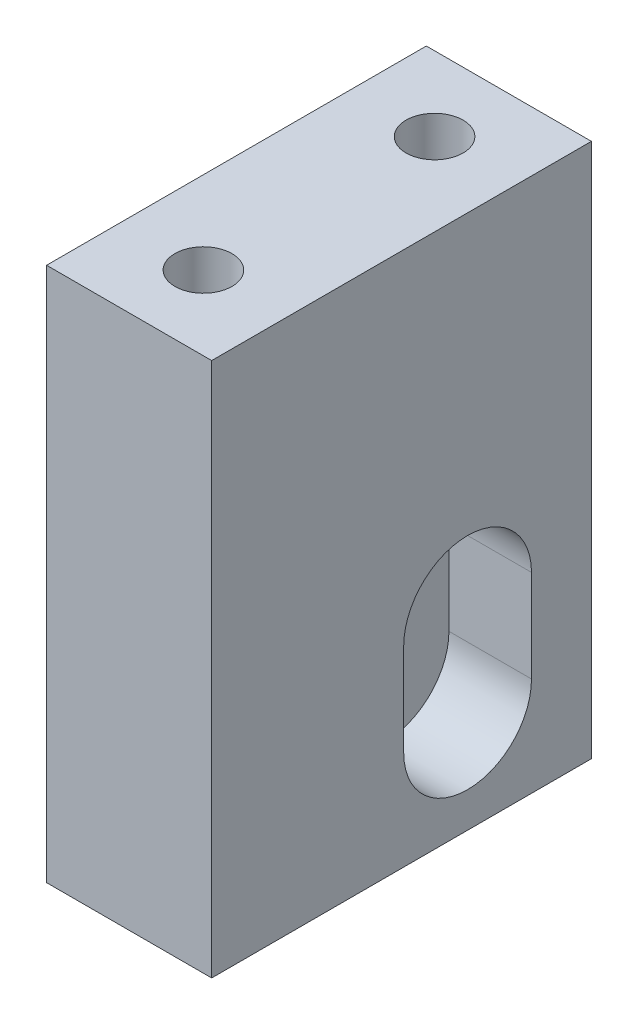
ISO-10303-21;
HEADER;
FILE_DESCRIPTION(('STEP AP214'),'2;1');
FILE_NAME('part.step','',(''),(''),'','','');
FILE_SCHEMA(('AUTOMOTIVE_DESIGN { 1 0 10303 214 1 1 1 1 }'));
ENDSEC;
DATA;
#1=APPLICATION_CONTEXT('core data for automotive mechanical design processes');
#2=APPLICATION_PROTOCOL_DEFINITION('international standard','automotive_design',2000,#1);
#3=PRODUCT_CONTEXT('',#1,'mechanical');
#4=PRODUCT('Part','Part','',(#3));
#5=PRODUCT_RELATED_PRODUCT_CATEGORY('part','',(#4));
#6=PRODUCT_DEFINITION_FORMATION('','',#4);
#7=PRODUCT_DEFINITION_CONTEXT('part definition',#1,'design');
#8=PRODUCT_DEFINITION('design','',#6,#7);
#9=PRODUCT_DEFINITION_SHAPE('','',#8);
#10=(LENGTH_UNIT() NAMED_UNIT(*) SI_UNIT(.MILLI.,.METRE.));
#11=(NAMED_UNIT(*) PLANE_ANGLE_UNIT() SI_UNIT($,.RADIAN.));
#12=(NAMED_UNIT(*) SI_UNIT($,.STERADIAN.) SOLID_ANGLE_UNIT());
#13=UNCERTAINTY_MEASURE_WITH_UNIT(LENGTH_MEASURE(1.E-05),#10,'distance_accuracy_value','');
#14=(GEOMETRIC_REPRESENTATION_CONTEXT(3) GLOBAL_UNCERTAINTY_ASSIGNED_CONTEXT((#13)) GLOBAL_UNIT_ASSIGNED_CONTEXT((#10,
#11,#12)) REPRESENTATION_CONTEXT('',''));
#15=CARTESIAN_POINT('',(0.,0.,0.));
#16=DIRECTION('',(0.,0.,1.));
#17=DIRECTION('',(1.,0.,0.));
#18=AXIS2_PLACEMENT_3D('',#15,#16,#17);
#19=CARTESIAN_POINT('',(23.7320965234533,0.445269886363636,3.84429899049199));
#20=DIRECTION('',(0.,-0.115056818181818,-0.993358912271831));
#21=DIRECTION('',(0.,0.993358912271832,-0.115056818181818));
#22=AXIS2_PLACEMENT_3D('',#19,#20,#21);
#23=PLANE('',#22);
#24=DIRECTION('',(0.,-0.993358912271832,0.115056818181818));
#25=VECTOR('',#24,1.);
#26=CARTESIAN_POINT('',(1.85,0.445269886363636,3.84429899049199));
#27=LINE('',#26,#25);
#28=CARTESIAN_POINT('',(1.85,14.3388778409091,2.23505755261163));
#29=VERTEX_POINT('',#28);
#30=CARTESIAN_POINT('',(1.85,8.08353865393432,2.95958865069716));
#31=VERTEX_POINT('',#30);
#32=EDGE_CURVE('E208',#29,#31,#27,.T.);
#33=ORIENTED_EDGE('',*,*,#32,.T.);
#34=DIRECTION('',(-1.,0.,0.));
#35=VECTOR('',#34,1.);
#36=CARTESIAN_POINT('',(20.414165562884,8.08353865393432,2.95958865069715));
#37=LINE('',#36,#35);
#38=CARTESIAN_POINT('',(0.,8.08353865393432,2.95958865069715));
#39=VERTEX_POINT('',#38);
#40=EDGE_CURVE('E58',#31,#39,#37,.T.);
#41=ORIENTED_EDGE('',*,*,#40,.T.);
#42=DIRECTION('',(0.,-0.993358912271831,0.115056818181818));
#43=VECTOR('',#42,1.);
#44=CARTESIAN_POINT('',(0.,0.445269886363636,3.84429899049199));
#45=LINE('',#44,#43);
#46=CARTESIAN_POINT('',(0.,14.3388778409091,2.23505755261163));
#47=VERTEX_POINT('',#46);
#48=EDGE_CURVE('E201',#47,#39,#45,.T.);
#49=ORIENTED_EDGE('',*,*,#48,.F.);
#50=DIRECTION('',(-1.,0.,0.));
#51=VECTOR('',#50,1.);
#52=CARTESIAN_POINT('',(23.7320965234533,14.3388778409091,2.23505755261163));
#53=LINE('',#52,#51);
#54=EDGE_CURVE('E204',#29,#47,#53,.T.);
#55=ORIENTED_EDGE('',*,*,#54,.F.);
#56=EDGE_LOOP('',(#33,#41,#49,#55));
#57=FACE_BOUND('',#56,.T.);
#58=ADVANCED_FACE('F37',(#57),#23,.T.);
#59=CARTESIAN_POINT('',(23.7320965234533,0.,0.));
#60=DIRECTION('',(-1.,0.,0.));
#61=DIRECTION('',(0.,0.,1.));
#62=AXIS2_PLACEMENT_3D('',#59,#60,#61);
#63=CYLINDRICAL_SURFACE('',#62,3.87);
#64=CARTESIAN_POINT('',(0.,0.,0.));
#65=DIRECTION('',(1.,0.,0.));
#66=DIRECTION('',(0.,0.,1.));
#67=AXIS2_PLACEMENT_3D('',#64,#65,#66);
#68=CIRCLE('',#67,3.87);
#69=CARTESIAN_POINT('',(0.,0.,3.87));
#70=VERTEX_POINT('',#69);
#71=CARTESIAN_POINT('',(0.,0.,-3.87));
#72=VERTEX_POINT('',#71);
#73=EDGE_CURVE('E198',#70,#72,#68,.T.);
#74=ORIENTED_EDGE('',*,*,#73,.F.);
#75=DIRECTION('',(-1.,0.,0.));
#76=VECTOR('',#75,1.);
#77=CARTESIAN_POINT('',(20.414165562884,0.,3.87));
#78=LINE('',#77,#76);
#79=CARTESIAN_POINT('',(5.,0.,3.87));
#80=VERTEX_POINT('',#79);
#81=EDGE_CURVE('E162',#80,#70,#78,.T.);
#82=ORIENTED_EDGE('',*,*,#81,.F.);
#83=CARTESIAN_POINT('',(5.,0.,0.));
#84=DIRECTION('',(1.,0.,0.));
#85=DIRECTION('',(0.,0.,-1.));
#86=AXIS2_PLACEMENT_3D('',#83,#84,#85);
#87=CIRCLE('',#86,3.87);
#88=CARTESIAN_POINT('',(5.,0.,-3.87));
#89=VERTEX_POINT('',#88);
#90=EDGE_CURVE('E182',#80,#89,#87,.T.);
#91=ORIENTED_EDGE('',*,*,#90,.T.);
#92=DIRECTION('',(-1.,0.,0.));
#93=VECTOR('',#92,1.);
#94=CARTESIAN_POINT('',(20.414165562884,0.,-3.87));
#95=LINE('',#94,#93);
#96=EDGE_CURVE('E176',#89,#72,#95,.T.);
#97=ORIENTED_EDGE('',*,*,#96,.T.);
#98=EDGE_LOOP('',(#74,#82,#91,#97));
#99=FACE_BOUND('',#98,.T.);
#100=ADVANCED_FACE('F267',(#99),#63,.F.);
#101=CARTESIAN_POINT('',(23.7320965234533,14.3388778409091,-2.23505755261161));
#102=DIRECTION('',(0.,-0.115056818181819,0.993358912271831));
#103=DIRECTION('',(0.,-0.993358912271831,-0.115056818181819));
#104=AXIS2_PLACEMENT_3D('',#101,#102,#103);
#105=PLANE('',#104);
#106=DIRECTION('',(0.,0.993358912271831,0.115056818181819));
#107=VECTOR('',#106,1.);
#108=CARTESIAN_POINT('',(0.,14.3388778409091,-2.23505755261161));
#109=LINE('',#108,#107);
#110=CARTESIAN_POINT('',(0.,8.08353865393433,-2.95958865069715));
#111=VERTEX_POINT('',#110);
#112=CARTESIAN_POINT('',(0.,14.3388778409091,-2.23505755261161));
#113=VERTEX_POINT('',#112);
#114=EDGE_CURVE('E195',#111,#113,#109,.T.);
#115=ORIENTED_EDGE('',*,*,#114,.F.);
#116=DIRECTION('',(-1.,0.,0.));
#117=VECTOR('',#116,1.);
#118=CARTESIAN_POINT('',(20.414165562884,8.08353865393433,-2.95958865069715));
#119=LINE('',#118,#117);
#120=CARTESIAN_POINT('',(1.85,8.08353865393433,-2.95958865069715));
#121=VERTEX_POINT('',#120);
#122=EDGE_CURVE('E178',#111,#121,#119,.F.);
#123=ORIENTED_EDGE('',*,*,#122,.T.);
#124=DIRECTION('',(0.,0.993358912271831,0.115056818181819));
#125=VECTOR('',#124,1.);
#126=CARTESIAN_POINT('',(1.85,14.3388778409091,-2.23505755261161));
#127=LINE('',#126,#125);
#128=CARTESIAN_POINT('',(1.85,14.3388778409091,-2.23505755261161));
#129=VERTEX_POINT('',#128);
#130=EDGE_CURVE('E197',#121,#129,#127,.T.);
#131=ORIENTED_EDGE('',*,*,#130,.T.);
#132=DIRECTION('',(-1.,0.,0.));
#133=VECTOR('',#132,1.);
#134=CARTESIAN_POINT('',(23.7320965234533,14.3388778409091,-2.23505755261161));
#135=LINE('',#134,#133);
#136=EDGE_CURVE('E194',#129,#113,#135,.T.);
#137=ORIENTED_EDGE('',*,*,#136,.T.);
#138=EDGE_LOOP('',(#115,#123,#131,#137));
#139=FACE_BOUND('',#138,.T.);
#140=ADVANCED_FACE('F273',(#139),#105,.T.);
#141=CARTESIAN_POINT('',(1.85,0.,0.));
#142=DIRECTION('',(1.,0.,0.));
#143=DIRECTION('',(0.,1.,0.));
#144=AXIS2_PLACEMENT_3D('',#141,#142,#143);
#145=PLANE('',#144);
#146=CARTESIAN_POINT('',(1.85,5.59,0.));
#147=DIRECTION('',(1.,0.,0.));
#148=DIRECTION('',(0.,1.,0.));
#149=AXIS2_PLACEMENT_3D('',#146,#147,#148);
#150=CIRCLE('',#149,3.87);
#151=EDGE_CURVE('E11',#31,#121,#150,.F.);
#152=ORIENTED_EDGE('',*,*,#151,.F.);
#153=ORIENTED_EDGE('',*,*,#32,.F.);
#154=CARTESIAN_POINT('',(1.85,14.08,0.));
#155=DIRECTION('',(1.,0.,0.));
#156=DIRECTION('',(0.,1.,0.));
#157=AXIS2_PLACEMENT_3D('',#154,#155,#156);
#158=CIRCLE('',#157,2.25);
#159=EDGE_CURVE('E212',#129,#29,#158,.T.);
#160=ORIENTED_EDGE('',*,*,#159,.F.);
#161=ORIENTED_EDGE('',*,*,#130,.F.);
#162=EDGE_LOOP('',(#152,#153,#160,#161));
#163=FACE_BOUND('',#162,.T.);
#164=ADVANCED_FACE('F282',(#163),#145,.F.);
#165=CARTESIAN_POINT('',(23.7320965234533,14.08,0.));
#166=DIRECTION('',(-1.,0.,0.));
#167=DIRECTION('',(0.,0.,1.));
#168=AXIS2_PLACEMENT_3D('',#165,#166,#167);
#169=CYLINDRICAL_SURFACE('',#168,2.25);
#170=ORIENTED_EDGE('',*,*,#159,.T.);
#171=ORIENTED_EDGE('',*,*,#54,.T.);
#172=CARTESIAN_POINT('',(0.,14.08,0.));
#173=DIRECTION('',(1.,0.,0.));
#174=DIRECTION('',(0.,0.,1.));
#175=AXIS2_PLACEMENT_3D('',#172,#173,#174);
#176=CIRCLE('',#175,2.25);
#177=EDGE_CURVE('E205',#113,#47,#176,.T.);
#178=ORIENTED_EDGE('',*,*,#177,.F.);
#179=ORIENTED_EDGE('',*,*,#136,.F.);
#180=EDGE_LOOP('',(#170,#171,#178,#179));
#181=FACE_BOUND('',#180,.T.);
#182=ADVANCED_FACE('F278',(#181),#169,.F.);
#183=CARTESIAN_POINT('',(0.,14.08,0.));
#184=DIRECTION('',(-1.,0.,0.));
#185=DIRECTION('',(0.,0.,1.));
#186=AXIS2_PLACEMENT_3D('',#183,#184,#185);
#187=PLANE('',#186);
#188=ORIENTED_EDGE('',*,*,#73,.T.);
#189=DIRECTION('',(0.,1.,0.));
#190=VECTOR('',#189,1.);
#191=CARTESIAN_POINT('',(0.,5.59,-3.87));
#192=LINE('',#191,#190);
#193=CARTESIAN_POINT('',(0.,5.59,-3.87));
#194=VERTEX_POINT('',#193);
#195=EDGE_CURVE('E172',#72,#194,#192,.T.);
#196=ORIENTED_EDGE('',*,*,#195,.T.);
#197=CARTESIAN_POINT('',(0.,5.59,0.));
#198=DIRECTION('',(1.,0.,0.));
#199=DIRECTION('',(0.,0.,1.));
#200=AXIS2_PLACEMENT_3D('',#197,#198,#199);
#201=CIRCLE('',#200,3.87);
#202=EDGE_CURVE('E168',#194,#111,#201,.T.);
#203=ORIENTED_EDGE('',*,*,#202,.T.);
#204=ORIENTED_EDGE('',*,*,#114,.T.);
#205=ORIENTED_EDGE('',*,*,#177,.T.);
#206=ORIENTED_EDGE('',*,*,#48,.T.);
#207=CARTESIAN_POINT('',(0.,5.59,3.87));
#208=VERTEX_POINT('',#207);
#209=EDGE_CURVE('E171',#39,#208,#201,.T.);
#210=ORIENTED_EDGE('',*,*,#209,.T.);
#211=DIRECTION('',(0.,-1.,0.));
#212=VECTOR('',#211,1.);
#213=CARTESIAN_POINT('',(0.,0.,3.87));
#214=LINE('',#213,#212);
#215=EDGE_CURVE('E163',#208,#70,#214,.T.);
#216=ORIENTED_EDGE('',*,*,#215,.T.);
#217=EDGE_LOOP('',(#188,#196,#203,#204,#205,#206,#210,#216));
#218=FACE_BOUND('',#217,.T.);
#219=ADVANCED_FACE('F281',(#218),#187,.F.);
#220=CARTESIAN_POINT('',(20.414165562884,5.59,-3.87));
#221=DIRECTION('',(0.,0.,1.));
#222=DIRECTION('',(0.,-1.,0.));
#223=AXIS2_PLACEMENT_3D('',#220,#221,#222);
#224=PLANE('',#223);
#225=DIRECTION('',(0.,1.,0.));
#226=VECTOR('',#225,1.);
#227=CARTESIAN_POINT('',(5.,5.59,-3.87));
#228=LINE('',#227,#226);
#229=CARTESIAN_POINT('',(5.,5.59,-3.87));
#230=VERTEX_POINT('',#229);
#231=EDGE_CURVE('E179',#89,#230,#228,.T.);
#232=ORIENTED_EDGE('',*,*,#231,.T.);
#233=DIRECTION('',(-1.,0.,0.));
#234=VECTOR('',#233,1.);
#235=CARTESIAN_POINT('',(20.414165562884,5.59,-3.87));
#236=LINE('',#235,#234);
#237=EDGE_CURVE('E175',#230,#194,#236,.T.);
#238=ORIENTED_EDGE('',*,*,#237,.T.);
#239=ORIENTED_EDGE('',*,*,#195,.F.);
#240=ORIENTED_EDGE('',*,*,#96,.F.);
#241=EDGE_LOOP('',(#232,#238,#239,#240));
#242=FACE_BOUND('',#241,.T.);
#243=ADVANCED_FACE('F383',(#242),#224,.T.);
#244=CARTESIAN_POINT('',(20.414165562884,5.59,0.));
#245=DIRECTION('',(-1.,0.,0.));
#246=DIRECTION('',(0.,0.,1.));
#247=AXIS2_PLACEMENT_3D('',#244,#245,#246);
#248=CYLINDRICAL_SURFACE('',#247,3.87);
#249=ORIENTED_EDGE('',*,*,#151,.T.);
#250=ORIENTED_EDGE('',*,*,#122,.F.);
#251=ORIENTED_EDGE('',*,*,#202,.F.);
#252=ORIENTED_EDGE('',*,*,#237,.F.);
#253=CARTESIAN_POINT('',(5.,5.59,0.));
#254=DIRECTION('',(1.,0.,0.));
#255=DIRECTION('',(0.,0.,-1.));
#256=AXIS2_PLACEMENT_3D('',#253,#254,#255);
#257=CIRCLE('',#256,3.87);
#258=CARTESIAN_POINT('',(5.,5.59,3.87));
#259=VERTEX_POINT('',#258);
#260=EDGE_CURVE('E52',#230,#259,#257,.T.);
#261=ORIENTED_EDGE('',*,*,#260,.T.);
#262=DIRECTION('',(-1.,0.,0.));
#263=VECTOR('',#262,1.);
#264=CARTESIAN_POINT('',(20.414165562884,5.59,3.87));
#265=LINE('',#264,#263);
#266=EDGE_CURVE('E167',#259,#208,#265,.T.);
#267=ORIENTED_EDGE('',*,*,#266,.T.);
#268=ORIENTED_EDGE('',*,*,#209,.F.);
#269=ORIENTED_EDGE('',*,*,#40,.F.);
#270=EDGE_LOOP('',(#249,#250,#251,#252,#261,#267,#268,#269));
#271=FACE_BOUND('',#270,.T.);
#272=ADVANCED_FACE('F374',(#271),#248,.F.);
#273=CARTESIAN_POINT('',(20.414165562884,0.,3.87));
#274=DIRECTION('',(0.,0.,-1.));
#275=DIRECTION('',(0.,1.,0.));
#276=AXIS2_PLACEMENT_3D('',#273,#274,#275);
#277=PLANE('',#276);
#278=DIRECTION('',(0.,-1.,0.));
#279=VECTOR('',#278,1.);
#280=CARTESIAN_POINT('',(5.,0.,3.87));
#281=LINE('',#280,#279);
#282=EDGE_CURVE('E166',#259,#80,#281,.T.);
#283=ORIENTED_EDGE('',*,*,#282,.T.);
#284=ORIENTED_EDGE('',*,*,#81,.T.);
#285=ORIENTED_EDGE('',*,*,#215,.F.);
#286=ORIENTED_EDGE('',*,*,#266,.F.);
#287=EDGE_LOOP('',(#283,#284,#285,#286));
#288=FACE_BOUND('',#287,.T.);
#289=ADVANCED_FACE('F289',(#288),#277,.T.);
#290=CARTESIAN_POINT('',(5.,0.,0.));
#291=DIRECTION('',(1.,0.,0.));
#292=DIRECTION('',(0.,0.,-1.));
#293=AXIS2_PLACEMENT_3D('',#290,#291,#292);
#294=PLANE('',#293);
#295=DIRECTION('',(0.,1.,0.));
#296=VECTOR('',#295,1.);
#297=CARTESIAN_POINT('',(5.,-6.,-7.5));
#298=LINE('',#297,#296);
#299=CARTESIAN_POINT('',(5.,-6.,-7.5));
#300=VERTEX_POINT('',#299);
#301=CARTESIAN_POINT('',(5.,26.3871066915758,-7.5));
#302=VERTEX_POINT('',#301);
#303=EDGE_CURVE('E211',#300,#302,#298,.T.);
#304=ORIENTED_EDGE('',*,*,#303,.T.);
#305=DIRECTION('',(0.,0.,1.));
#306=VECTOR('',#305,1.);
#307=CARTESIAN_POINT('',(5.,26.3871066915758,-7.5));
#308=LINE('',#307,#306);
#309=CARTESIAN_POINT('',(5.,26.3871066915758,15.5));
#310=VERTEX_POINT('',#309);
#311=EDGE_CURVE('E231',#302,#310,#308,.T.);
#312=ORIENTED_EDGE('',*,*,#311,.T.);
#313=DIRECTION('',(0.,1.,0.));
#314=VECTOR('',#313,1.);
#315=CARTESIAN_POINT('',(5.,-18.8062484748657,15.5));
#316=LINE('',#315,#314);
#317=CARTESIAN_POINT('',(5.,-6.00000000000001,15.5));
#318=VERTEX_POINT('',#317);
#319=EDGE_CURVE('E156',#318,#310,#316,.T.);
#320=ORIENTED_EDGE('',*,*,#319,.F.);
#321=DIRECTION('',(0.,0.,-1.));
#322=VECTOR('',#321,1.);
#323=CARTESIAN_POINT('',(5.,-6.,-7.5));
#324=LINE('',#323,#322);
#325=EDGE_CURVE('E223',#318,#300,#324,.T.);
#326=ORIENTED_EDGE('',*,*,#325,.T.);
#327=EDGE_LOOP('',(#304,#312,#320,#326));
#328=FACE_BOUND('',#327,.T.);
#329=ORIENTED_EDGE('',*,*,#231,.F.);
#330=ORIENTED_EDGE('',*,*,#90,.F.);
#331=ORIENTED_EDGE('',*,*,#282,.F.);
#332=ORIENTED_EDGE('',*,*,#260,.F.);
#333=EDGE_LOOP('',(#329,#330,#331,#332));
#334=FACE_BOUND('',#333,.T.);
#335=ADVANCED_FACE('F245',(#328,#334),#294,.T.);
#336=CARTESIAN_POINT('',(-5.,-6.,-7.5));
#337=DIRECTION('',(0.,0.,-1.));
#338=DIRECTION('',(-1.,0.,0.));
#339=AXIS2_PLACEMENT_3D('',#336,#337,#338);
#340=PLANE('',#339);
#341=ORIENTED_EDGE('',*,*,#303,.F.);
#342=DIRECTION('',(1.,0.,0.));
#343=VECTOR('',#342,1.);
#344=CARTESIAN_POINT('',(-5.,-6.,-7.5));
#345=LINE('',#344,#343);
#346=CARTESIAN_POINT('',(-5.,-6.,-7.5));
#347=VERTEX_POINT('',#346);
#348=EDGE_CURVE('E45',#347,#300,#345,.T.);
#349=ORIENTED_EDGE('',*,*,#348,.F.);
#350=DIRECTION('',(0.,1.,0.));
#351=VECTOR('',#350,1.);
#352=CARTESIAN_POINT('',(-5.,-6.,-7.5));
#353=LINE('',#352,#351);
#354=CARTESIAN_POINT('',(-5.,26.3871066915758,-7.5));
#355=VERTEX_POINT('',#354);
#356=EDGE_CURVE('E219',#347,#355,#353,.T.);
#357=ORIENTED_EDGE('',*,*,#356,.T.);
#358=DIRECTION('',(1.,0.,0.));
#359=VECTOR('',#358,1.);
#360=CARTESIAN_POINT('',(-5.,26.3871066915758,-7.5));
#361=LINE('',#360,#359);
#362=EDGE_CURVE('E228',#355,#302,#361,.T.);
#363=ORIENTED_EDGE('',*,*,#362,.T.);
#364=EDGE_LOOP('',(#341,#349,#357,#363));
#365=FACE_BOUND('',#364,.T.);
#366=ADVANCED_FACE('F39',(#365),#340,.T.);
#367=CARTESIAN_POINT('',(-5.,-6.,-7.5));
#368=DIRECTION('',(0.,-1.,0.));
#369=DIRECTION('',(0.,0.,-1.));
#370=AXIS2_PLACEMENT_3D('',#367,#368,#369);
#371=PLANE('',#370);
#372=ORIENTED_EDGE('',*,*,#325,.F.);
#373=DIRECTION('',(1.,0.,0.));
#374=VECTOR('',#373,1.);
#375=CARTESIAN_POINT('',(5.,-6.,15.5));
#376=LINE('',#375,#374);
#377=CARTESIAN_POINT('',(-5.,-6.,15.5));
#378=VERTEX_POINT('',#377);
#379=EDGE_CURVE('E153',#378,#318,#376,.T.);
#380=ORIENTED_EDGE('',*,*,#379,.F.);
#381=DIRECTION('',(0.,0.,-1.));
#382=VECTOR('',#381,1.);
#383=CARTESIAN_POINT('',(-5.,-6.,-7.5));
#384=LINE('',#383,#382);
#385=EDGE_CURVE('E225',#378,#347,#384,.T.);
#386=ORIENTED_EDGE('',*,*,#385,.T.);
#387=ORIENTED_EDGE('',*,*,#348,.T.);
#388=EDGE_LOOP('',(#372,#380,#386,#387));
#389=FACE_BOUND('',#388,.T.);
#390=ADVANCED_FACE('F249',(#389),#371,.T.);
#391=CARTESIAN_POINT('',(-5.,26.3871066915758,-7.5));
#392=DIRECTION('',(0.,1.,0.));
#393=DIRECTION('',(0.,0.,1.));
#394=AXIS2_PLACEMENT_3D('',#391,#392,#393);
#395=PLANE('',#394);
#396=CARTESIAN_POINT('',(0.,26.3871066915758,11.));
#397=DIRECTION('',(0.,1.,0.));
#398=DIRECTION('',(0.,0.,1.));
#399=AXIS2_PLACEMENT_3D('',#396,#397,#398);
#400=CIRCLE('',#399,1.72719999999999);
#401=CARTESIAN_POINT('',(0.,26.3871066915758,12.7272));
#402=VERTEX_POINT('',#401);
#403=EDGE_CURVE('E140',#402,#402,#400,.T.);
#404=ORIENTED_EDGE('',*,*,#403,.F.);
#405=EDGE_LOOP('',(#404));
#406=FACE_BOUND('',#405,.T.);
#407=CARTESIAN_POINT('',(0.,26.3871066915758,-2.99999999999999));
#408=DIRECTION('',(0.,1.,0.));
#409=DIRECTION('',(0.,0.,1.));
#410=AXIS2_PLACEMENT_3D('',#407,#408,#409);
#411=CIRCLE('',#410,1.72719999999999);
#412=CARTESIAN_POINT('',(0.,26.3871066915758,-1.2728));
#413=VERTEX_POINT('',#412);
#414=EDGE_CURVE('E139',#413,#413,#411,.T.);
#415=ORIENTED_EDGE('',*,*,#414,.F.);
#416=EDGE_LOOP('',(#415));
#417=FACE_BOUND('',#416,.T.);
#418=ORIENTED_EDGE('',*,*,#311,.F.);
#419=ORIENTED_EDGE('',*,*,#362,.F.);
#420=DIRECTION('',(0.,0.,1.));
#421=VECTOR('',#420,1.);
#422=CARTESIAN_POINT('',(-5.,26.3871066915758,-7.5));
#423=LINE('',#422,#421);
#424=CARTESIAN_POINT('',(-5.,26.3871066915758,15.5));
#425=VERTEX_POINT('',#424);
#426=EDGE_CURVE('E222',#355,#425,#423,.T.);
#427=ORIENTED_EDGE('',*,*,#426,.T.);
#428=DIRECTION('',(1.,0.,0.));
#429=VECTOR('',#428,1.);
#430=CARTESIAN_POINT('',(5.,26.3871066915758,15.5));
#431=LINE('',#430,#429);
#432=EDGE_CURVE('E150',#425,#310,#431,.T.);
#433=ORIENTED_EDGE('',*,*,#432,.T.);
#434=EDGE_LOOP('',(#418,#419,#427,#433));
#435=FACE_BOUND('',#434,.T.);
#436=ADVANCED_FACE('F241',(#406,#417,#435),#395,.T.);
#437=CARTESIAN_POINT('',(-5.,0.,0.));
#438=DIRECTION('',(1.,0.,0.));
#439=DIRECTION('',(0.,0.,-1.));
#440=AXIS2_PLACEMENT_3D('',#437,#438,#439);
#441=PLANE('',#440);
#442=ORIENTED_EDGE('',*,*,#356,.F.);
#443=ORIENTED_EDGE('',*,*,#385,.F.);
#444=DIRECTION('',(0.,1.,0.));
#445=VECTOR('',#444,1.);
#446=CARTESIAN_POINT('',(-5.,-18.8062484748657,15.5));
#447=LINE('',#446,#445);
#448=EDGE_CURVE('E159',#378,#425,#447,.T.);
#449=ORIENTED_EDGE('',*,*,#448,.T.);
#450=ORIENTED_EDGE('',*,*,#426,.F.);
#451=EDGE_LOOP('',(#442,#443,#449,#450));
#452=FACE_BOUND('',#451,.T.);
#453=ADVANCED_FACE('F252',(#452),#441,.F.);
#454=CARTESIAN_POINT('',(5.,-18.8062484748657,15.5));
#455=DIRECTION('',(0.,0.,1.));
#456=DIRECTION('',(0.,-1.,0.));
#457=AXIS2_PLACEMENT_3D('',#454,#455,#456);
#458=PLANE('',#457);
#459=ORIENTED_EDGE('',*,*,#448,.F.);
#460=ORIENTED_EDGE('',*,*,#379,.T.);
#461=ORIENTED_EDGE('',*,*,#319,.T.);
#462=ORIENTED_EDGE('',*,*,#432,.F.);
#463=EDGE_LOOP('',(#459,#460,#461,#462));
#464=FACE_BOUND('',#463,.T.);
#465=ADVANCED_FACE('F254',(#464),#458,.T.);
#466=CARTESIAN_POINT('',(0.,16.3871066915758,-3.));
#467=DIRECTION('',(0.,1.,0.));
#468=DIRECTION('',(0.,0.,1.));
#469=AXIS2_PLACEMENT_3D('',#466,#467,#468);
#470=CONICAL_SURFACE('',#469,1.7272,1.02974425867665);
#471=CARTESIAN_POINT('',(0.,15.3493002303914,-3.));
#472=VERTEX_POINT('',#471);
#473=VERTEX_LOOP('',#472);
#474=FACE_BOUND('',#473,.T.);
#475=CARTESIAN_POINT('',(0.,16.3871066915758,-3.));
#476=DIRECTION('',(0.,1.,0.));
#477=DIRECTION('',(0.,0.,1.));
#478=AXIS2_PLACEMENT_3D('',#475,#476,#477);
#479=CIRCLE('',#478,1.7272);
#480=CARTESIAN_POINT('',(0.,16.3871066915758,-1.2728));
#481=VERTEX_POINT('',#480);
#482=EDGE_CURVE('E143',#481,#481,#479,.T.);
#483=ORIENTED_EDGE('',*,*,#482,.T.);
#484=EDGE_LOOP('',(#483));
#485=FACE_BOUND('',#484,.T.);
#486=ADVANCED_FACE('F256',(#474,#485),#470,.F.);
#487=CARTESIAN_POINT('',(0.,26.3871066915758,-2.99999999999999));
#488=DIRECTION('',(0.,1.,0.));
#489=DIRECTION('',(0.,0.,1.));
#490=AXIS2_PLACEMENT_3D('',#487,#488,#489);
#491=CYLINDRICAL_SURFACE('',#490,1.72719999999999);
#492=ORIENTED_EDGE('',*,*,#482,.F.);
#493=EDGE_LOOP('',(#492));
#494=FACE_BOUND('',#493,.T.);
#495=ORIENTED_EDGE('',*,*,#414,.T.);
#496=EDGE_LOOP('',(#495));
#497=FACE_BOUND('',#496,.T.);
#498=ADVANCED_FACE('F133',(#494,#497),#491,.F.);
#499=CARTESIAN_POINT('',(0.,16.3871066915758,11.));
#500=DIRECTION('',(0.,1.,0.));
#501=DIRECTION('',(0.,0.,1.));
#502=AXIS2_PLACEMENT_3D('',#499,#500,#501);
#503=CONICAL_SURFACE('',#502,1.7272,1.02974425867665);
#504=CARTESIAN_POINT('',(0.,15.3493002303914,11.));
#505=VERTEX_POINT('',#504);
#506=VERTEX_LOOP('',#505);
#507=FACE_BOUND('',#506,.T.);
#508=CARTESIAN_POINT('',(0.,16.3871066915758,11.));
#509=DIRECTION('',(0.,1.,0.));
#510=DIRECTION('',(0.,0.,1.));
#511=AXIS2_PLACEMENT_3D('',#508,#509,#510);
#512=CIRCLE('',#511,1.7272);
#513=CARTESIAN_POINT('',(0.,16.3871066915758,12.7272));
#514=VERTEX_POINT('',#513);
#515=EDGE_CURVE('E137',#514,#514,#512,.T.);
#516=ORIENTED_EDGE('',*,*,#515,.T.);
#517=EDGE_LOOP('',(#516));
#518=FACE_BOUND('',#517,.T.);
#519=ADVANCED_FACE('F129',(#507,#518),#503,.F.);
#520=CARTESIAN_POINT('',(0.,26.3871066915758,11.));
#521=DIRECTION('',(0.,1.,0.));
#522=DIRECTION('',(0.,0.,1.));
#523=AXIS2_PLACEMENT_3D('',#520,#521,#522);
#524=CYLINDRICAL_SURFACE('',#523,1.72719999999999);
#525=ORIENTED_EDGE('',*,*,#515,.F.);
#526=EDGE_LOOP('',(#525));
#527=FACE_BOUND('',#526,.T.);
#528=ORIENTED_EDGE('',*,*,#403,.T.);
#529=EDGE_LOOP('',(#528));
#530=FACE_BOUND('',#529,.T.);
#531=ADVANCED_FACE('F132',(#527,#530),#524,.F.);
#532=CLOSED_SHELL('',(#58,#100,#140,#164,#182,#219,#243,#272,#289,#335,#366,#390,#436,#453,#465,
#486,#498,#519,#531));
#533=MANIFOLD_SOLID_BREP('B2',#532);
#534=ADVANCED_BREP_SHAPE_REPRESENTATION('',(#18,#533),#14);
#535=SHAPE_DEFINITION_REPRESENTATION(#9,#534);
ENDSEC;
END-ISO-10303-21;
